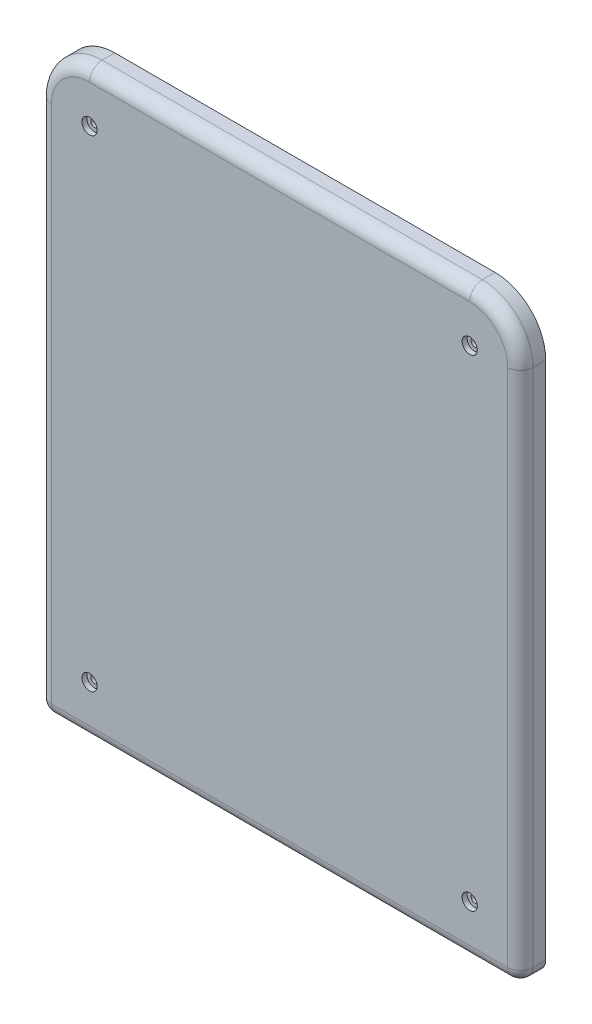
ISO-10303-21;
HEADER;
FILE_DESCRIPTION(('STEP AP214'),'2;1');
FILE_NAME('part.step','',(''),(''),'','','');
FILE_SCHEMA(('AUTOMOTIVE_DESIGN { 1 0 10303 214 1 1 1 1 }'));
ENDSEC;
DATA;
#1=APPLICATION_CONTEXT('core data for automotive mechanical design processes');
#2=APPLICATION_PROTOCOL_DEFINITION('international standard','automotive_design',2000,#1);
#3=PRODUCT_CONTEXT('',#1,'mechanical');
#4=PRODUCT('Part','Part','',(#3));
#5=PRODUCT_RELATED_PRODUCT_CATEGORY('part','',(#4));
#6=PRODUCT_DEFINITION_FORMATION('','',#4);
#7=PRODUCT_DEFINITION_CONTEXT('part definition',#1,'design');
#8=PRODUCT_DEFINITION('design','',#6,#7);
#9=PRODUCT_DEFINITION_SHAPE('','',#8);
#10=(LENGTH_UNIT() NAMED_UNIT(*) SI_UNIT(.MILLI.,.METRE.));
#11=(NAMED_UNIT(*) PLANE_ANGLE_UNIT() SI_UNIT($,.RADIAN.));
#12=(NAMED_UNIT(*) SI_UNIT($,.STERADIAN.) SOLID_ANGLE_UNIT());
#13=UNCERTAINTY_MEASURE_WITH_UNIT(LENGTH_MEASURE(1.E-05),#10,'distance_accuracy_value','');
#14=(GEOMETRIC_REPRESENTATION_CONTEXT(3) GLOBAL_UNCERTAINTY_ASSIGNED_CONTEXT((#13)) GLOBAL_UNIT_ASSIGNED_CONTEXT((#10,
#11,#12)) REPRESENTATION_CONTEXT('',''));
#15=CARTESIAN_POINT('',(0.,0.,0.));
#16=DIRECTION('',(0.,0.,1.));
#17=DIRECTION('',(1.,0.,0.));
#18=AXIS2_PLACEMENT_3D('',#15,#16,#17);
#19=CARTESIAN_POINT('',(20.,-174.28484726422,-0.000999999999999265));
#20=DIRECTION('',(0.,0.,1.));
#21=DIRECTION('',(1.,0.,0.));
#22=AXIS2_PLACEMENT_3D('',#19,#20,#21);
#23=CYLINDRICAL_SURFACE('',#22,1.5);
#24=CARTESIAN_POINT('',(20.,-174.28484726422,0.));
#25=DIRECTION('',(0.,0.,1.));
#26=DIRECTION('',(1.,0.,0.));
#27=AXIS2_PLACEMENT_3D('',#24,#25,#26);
#28=CIRCLE('',#27,1.5);
#29=CARTESIAN_POINT('',(21.5,-174.28484726422,0.));
#30=VERTEX_POINT('',#29);
#31=EDGE_CURVE('E145',#30,#30,#28,.F.);
#32=ORIENTED_EDGE('',*,*,#31,.T.);
#33=EDGE_LOOP('',(#32));
#34=FACE_BOUND('',#33,.T.);
#35=CARTESIAN_POINT('',(20.,-174.28484726422,8.));
#36=DIRECTION('',(0.,0.,1.));
#37=DIRECTION('',(1.,0.,0.));
#38=AXIS2_PLACEMENT_3D('',#35,#36,#37);
#39=CIRCLE('',#38,1.5);
#40=CARTESIAN_POINT('',(21.5,-174.28484726422,8.));
#41=VERTEX_POINT('',#40);
#42=EDGE_CURVE('E37',#41,#41,#39,.F.);
#43=ORIENTED_EDGE('',*,*,#42,.F.);
#44=EDGE_LOOP('',(#43));
#45=FACE_BOUND('',#44,.T.);
#46=ADVANCED_FACE('F33',(#34,#45),#23,.F.);
#47=CARTESIAN_POINT('',(170.,-174.28484726422,-0.000999999999999265));
#48=DIRECTION('',(0.,0.,1.));
#49=DIRECTION('',(1.,0.,0.));
#50=AXIS2_PLACEMENT_3D('',#47,#48,#49);
#51=CYLINDRICAL_SURFACE('',#50,1.5);
#52=CARTESIAN_POINT('',(170.,-174.28484726422,0.));
#53=DIRECTION('',(0.,0.,1.));
#54=DIRECTION('',(1.,0.,0.));
#55=AXIS2_PLACEMENT_3D('',#52,#53,#54);
#56=CIRCLE('',#55,1.5);
#57=CARTESIAN_POINT('',(171.5,-174.28484726422,0.));
#58=VERTEX_POINT('',#57);
#59=EDGE_CURVE('E237',#58,#58,#56,.F.);
#60=ORIENTED_EDGE('',*,*,#59,.T.);
#61=EDGE_LOOP('',(#60));
#62=FACE_BOUND('',#61,.T.);
#63=CARTESIAN_POINT('',(170.,-174.28484726422,8.));
#64=DIRECTION('',(0.,0.,1.));
#65=DIRECTION('',(1.,0.,0.));
#66=AXIS2_PLACEMENT_3D('',#63,#64,#65);
#67=CIRCLE('',#66,1.5);
#68=CARTESIAN_POINT('',(171.5,-174.28484726422,8.));
#69=VERTEX_POINT('',#68);
#70=EDGE_CURVE('E224',#69,#69,#67,.F.);
#71=ORIENTED_EDGE('',*,*,#70,.F.);
#72=EDGE_LOOP('',(#71));
#73=FACE_BOUND('',#72,.T.);
#74=ADVANCED_FACE('F340',(#62,#73),#51,.F.);
#75=CARTESIAN_POINT('',(170.,15.7151527357802,-0.000999999999999265));
#76=DIRECTION('',(0.,0.,1.));
#77=DIRECTION('',(1.,0.,0.));
#78=AXIS2_PLACEMENT_3D('',#75,#76,#77);
#79=CYLINDRICAL_SURFACE('',#78,1.5);
#80=CARTESIAN_POINT('',(170.,15.7151527357802,0.));
#81=DIRECTION('',(0.,0.,1.));
#82=DIRECTION('',(1.,0.,0.));
#83=AXIS2_PLACEMENT_3D('',#80,#81,#82);
#84=CIRCLE('',#83,1.5);
#85=CARTESIAN_POINT('',(171.5,15.7151527357802,0.));
#86=VERTEX_POINT('',#85);
#87=EDGE_CURVE('E233',#86,#86,#84,.F.);
#88=ORIENTED_EDGE('',*,*,#87,.T.);
#89=EDGE_LOOP('',(#88));
#90=FACE_BOUND('',#89,.T.);
#91=CARTESIAN_POINT('',(170.,15.7151527357802,8.));
#92=DIRECTION('',(0.,0.,1.));
#93=DIRECTION('',(1.,0.,0.));
#94=AXIS2_PLACEMENT_3D('',#91,#92,#93);
#95=CIRCLE('',#94,1.5);
#96=CARTESIAN_POINT('',(171.5,15.7151527357802,8.));
#97=VERTEX_POINT('',#96);
#98=EDGE_CURVE('E221',#97,#97,#95,.F.);
#99=ORIENTED_EDGE('',*,*,#98,.F.);
#100=EDGE_LOOP('',(#99));
#101=FACE_BOUND('',#100,.T.);
#102=ADVANCED_FACE('F346',(#90,#101),#79,.F.);
#103=CARTESIAN_POINT('',(20.,15.7151527357802,-0.000999999999999265));
#104=DIRECTION('',(0.,0.,1.));
#105=DIRECTION('',(1.,0.,0.));
#106=AXIS2_PLACEMENT_3D('',#103,#104,#105);
#107=CYLINDRICAL_SURFACE('',#106,1.5);
#108=CARTESIAN_POINT('',(20.,15.7151527357802,0.));
#109=DIRECTION('',(0.,0.,1.));
#110=DIRECTION('',(1.,0.,0.));
#111=AXIS2_PLACEMENT_3D('',#108,#109,#110);
#112=CIRCLE('',#111,1.5);
#113=CARTESIAN_POINT('',(21.5,15.7151527357802,0.));
#114=VERTEX_POINT('',#113);
#115=EDGE_CURVE('E229',#114,#114,#112,.F.);
#116=ORIENTED_EDGE('',*,*,#115,.T.);
#117=EDGE_LOOP('',(#116));
#118=FACE_BOUND('',#117,.T.);
#119=CARTESIAN_POINT('',(20.,15.7151527357802,8.));
#120=DIRECTION('',(0.,0.,1.));
#121=DIRECTION('',(1.,0.,0.));
#122=AXIS2_PLACEMENT_3D('',#119,#120,#121);
#123=CIRCLE('',#122,1.5);
#124=CARTESIAN_POINT('',(21.5,15.7151527357802,8.));
#125=VERTEX_POINT('',#124);
#126=EDGE_CURVE('E218',#125,#125,#123,.F.);
#127=ORIENTED_EDGE('',*,*,#126,.F.);
#128=EDGE_LOOP('',(#127));
#129=FACE_BOUND('',#128,.T.);
#130=ADVANCED_FACE('F352',(#118,#129),#107,.F.);
#131=CARTESIAN_POINT('',(20.,15.7151527357802,10.));
#132=DIRECTION('',(0.,0.,-1.));
#133=DIRECTION('',(-1.,0.,0.));
#134=AXIS2_PLACEMENT_3D('',#131,#132,#133);
#135=CYLINDRICAL_SURFACE('',#134,20.);
#136=DIRECTION('',(0.,0.,-1.));
#137=VECTOR('',#136,1.);
#138=CARTESIAN_POINT('',(0.,15.7151527357802,10.));
#139=LINE('',#138,#137);
#140=CARTESIAN_POINT('',(0.,15.7151527357802,5.));
#141=VERTEX_POINT('',#140);
#142=CARTESIAN_POINT('',(0.,15.7151527357802,0.));
#143=VERTEX_POINT('',#142);
#144=EDGE_CURVE('E115',#141,#143,#139,.T.);
#145=ORIENTED_EDGE('',*,*,#144,.F.);
#146=CARTESIAN_POINT('',(20.,15.7151527357802,5.));
#147=DIRECTION('',(0.,0.,1.));
#148=DIRECTION('',(1.,0.,0.));
#149=AXIS2_PLACEMENT_3D('',#146,#147,#148);
#150=CIRCLE('',#149,20.);
#151=CARTESIAN_POINT('',(20.,35.7151527357802,5.));
#152=VERTEX_POINT('',#151);
#153=EDGE_CURVE('E11',#141,#152,#150,.F.);
#154=ORIENTED_EDGE('',*,*,#153,.T.);
#155=DIRECTION('',(0.,0.,-1.));
#156=VECTOR('',#155,1.);
#157=CARTESIAN_POINT('',(20.,35.7151527357802,10.));
#158=LINE('',#157,#156);
#159=CARTESIAN_POINT('',(20.,35.7151527357802,0.));
#160=VERTEX_POINT('',#159);
#161=EDGE_CURVE('E137',#152,#160,#158,.T.);
#162=ORIENTED_EDGE('',*,*,#161,.T.);
#163=CARTESIAN_POINT('',(20.,15.7151527357802,0.));
#164=DIRECTION('',(0.,0.,1.));
#165=DIRECTION('',(1.,0.,0.));
#166=AXIS2_PLACEMENT_3D('',#163,#164,#165);
#167=CIRCLE('',#166,20.);
#168=EDGE_CURVE('E130',#160,#143,#167,.T.);
#169=ORIENTED_EDGE('',*,*,#168,.T.);
#170=EDGE_LOOP('',(#145,#154,#162,#169));
#171=FACE_BOUND('',#170,.T.);
#172=ADVANCED_FACE('F135',(#171),#135,.T.);
#173=CARTESIAN_POINT('',(0.,15.7151527357802,10.));
#174=DIRECTION('',(1.,0.,0.));
#175=DIRECTION('',(0.,0.,-1.));
#176=AXIS2_PLACEMENT_3D('',#173,#174,#175);
#177=PLANE('',#176);
#178=DIRECTION('',(0.,0.,-1.));
#179=VECTOR('',#178,1.);
#180=CARTESIAN_POINT('',(0.,-189.28484726422,10.));
#181=LINE('',#180,#179);
#182=CARTESIAN_POINT('',(0.,-189.28484726422,5.));
#183=VERTEX_POINT('',#182);
#184=CARTESIAN_POINT('',(0.,-189.28484726422,0.));
#185=VERTEX_POINT('',#184);
#186=EDGE_CURVE('E124',#183,#185,#181,.T.);
#187=ORIENTED_EDGE('',*,*,#186,.F.);
#188=DIRECTION('',(0.,-1.,0.));
#189=VECTOR('',#188,1.);
#190=CARTESIAN_POINT('',(0.,15.7151527357802,5.));
#191=LINE('',#190,#189);
#192=EDGE_CURVE('E42',#183,#141,#191,.F.);
#193=ORIENTED_EDGE('',*,*,#192,.T.);
#194=ORIENTED_EDGE('',*,*,#144,.T.);
#195=DIRECTION('',(0.,-1.,0.));
#196=VECTOR('',#195,1.);
#197=CARTESIAN_POINT('',(0.,15.7151527357802,0.));
#198=LINE('',#197,#196);
#199=EDGE_CURVE('E118',#143,#185,#198,.T.);
#200=ORIENTED_EDGE('',*,*,#199,.T.);
#201=EDGE_LOOP('',(#187,#193,#194,#200));
#202=FACE_BOUND('',#201,.T.);
#203=ADVANCED_FACE('F117',(#202),#177,.F.);
#204=CARTESIAN_POINT('',(5.,-189.28484726422,10.));
#205=DIRECTION('',(0.,0.,-1.));
#206=DIRECTION('',(-1.,0.,0.));
#207=AXIS2_PLACEMENT_3D('',#204,#205,#206);
#208=CYLINDRICAL_SURFACE('',#207,5.);
#209=DIRECTION('',(0.,0.,-1.));
#210=VECTOR('',#209,1.);
#211=CARTESIAN_POINT('',(5.,-194.28484726422,10.));
#212=LINE('',#211,#210);
#213=CARTESIAN_POINT('',(5.,-194.28484726422,5.));
#214=VERTEX_POINT('',#213);
#215=CARTESIAN_POINT('',(5.,-194.28484726422,0.));
#216=VERTEX_POINT('',#215);
#217=EDGE_CURVE('E172',#214,#216,#212,.T.);
#218=ORIENTED_EDGE('',*,*,#217,.F.);
#219=CARTESIAN_POINT('',(5.,-189.28484726422,5.));
#220=DIRECTION('',(0.,0.,-1.));
#221=DIRECTION('',(-1.,0.,0.));
#222=AXIS2_PLACEMENT_3D('',#219,#220,#221);
#223=CIRCLE('',#222,5.);
#224=EDGE_CURVE('E57',#214,#183,#223,.T.);
#225=ORIENTED_EDGE('',*,*,#224,.T.);
#226=ORIENTED_EDGE('',*,*,#186,.T.);
#227=CARTESIAN_POINT('',(5.,-189.28484726422,0.));
#228=DIRECTION('',(0.,0.,1.));
#229=DIRECTION('',(1.,0.,0.));
#230=AXIS2_PLACEMENT_3D('',#227,#228,#229);
#231=CIRCLE('',#230,5.);
#232=EDGE_CURVE('E133',#185,#216,#231,.T.);
#233=ORIENTED_EDGE('',*,*,#232,.T.);
#234=EDGE_LOOP('',(#218,#225,#226,#233));
#235=FACE_BOUND('',#234,.T.);
#236=ADVANCED_FACE('F413',(#235),#208,.T.);
#237=CARTESIAN_POINT('',(5.,-194.28484726422,10.));
#238=DIRECTION('',(0.,1.,0.));
#239=DIRECTION('',(0.,0.,1.));
#240=AXIS2_PLACEMENT_3D('',#237,#238,#239);
#241=PLANE('',#240);
#242=DIRECTION('',(0.,0.,-1.));
#243=VECTOR('',#242,1.);
#244=CARTESIAN_POINT('',(185.,-194.28484726422,10.));
#245=LINE('',#244,#243);
#246=CARTESIAN_POINT('',(185.,-194.28484726422,5.));
#247=VERTEX_POINT('',#246);
#248=CARTESIAN_POINT('',(185.,-194.28484726422,0.));
#249=VERTEX_POINT('',#248);
#250=EDGE_CURVE('E170',#247,#249,#245,.T.);
#251=ORIENTED_EDGE('',*,*,#250,.F.);
#252=DIRECTION('',(1.,0.,0.));
#253=VECTOR('',#252,1.);
#254=CARTESIAN_POINT('',(5.,-194.28484726422,5.));
#255=LINE('',#254,#253);
#256=EDGE_CURVE('E196',#247,#214,#255,.F.);
#257=ORIENTED_EDGE('',*,*,#256,.T.);
#258=ORIENTED_EDGE('',*,*,#217,.T.);
#259=DIRECTION('',(1.,0.,0.));
#260=VECTOR('',#259,1.);
#261=CARTESIAN_POINT('',(5.,-194.28484726422,0.));
#262=LINE('',#261,#260);
#263=EDGE_CURVE('E149',#216,#249,#262,.T.);
#264=ORIENTED_EDGE('',*,*,#263,.T.);
#265=EDGE_LOOP('',(#251,#257,#258,#264));
#266=FACE_BOUND('',#265,.T.);
#267=ADVANCED_FACE('F556',(#266),#241,.F.);
#268=CARTESIAN_POINT('',(185.,-189.28484726422,10.));
#269=DIRECTION('',(0.,0.,-1.));
#270=DIRECTION('',(-1.,0.,0.));
#271=AXIS2_PLACEMENT_3D('',#268,#269,#270);
#272=CYLINDRICAL_SURFACE('',#271,4.99999999999998);
#273=DIRECTION('',(0.,0.,-1.));
#274=VECTOR('',#273,1.);
#275=CARTESIAN_POINT('',(190.,-189.28484726422,10.));
#276=LINE('',#275,#274);
#277=CARTESIAN_POINT('',(190.,-189.28484726422,5.));
#278=VERTEX_POINT('',#277);
#279=CARTESIAN_POINT('',(190.,-189.28484726422,0.));
#280=VERTEX_POINT('',#279);
#281=EDGE_CURVE('E168',#278,#280,#276,.T.);
#282=ORIENTED_EDGE('',*,*,#281,.F.);
#283=CARTESIAN_POINT('',(185.,-189.28484726422,5.));
#284=DIRECTION('',(0.,0.,-1.));
#285=DIRECTION('',(-1.,0.,0.));
#286=AXIS2_PLACEMENT_3D('',#283,#284,#285);
#287=CIRCLE('',#286,4.99999999999998);
#288=EDGE_CURVE('E194',#278,#247,#287,.T.);
#289=ORIENTED_EDGE('',*,*,#288,.T.);
#290=ORIENTED_EDGE('',*,*,#250,.T.);
#291=CARTESIAN_POINT('',(185.,-189.28484726422,0.));
#292=DIRECTION('',(0.,0.,1.));
#293=DIRECTION('',(-1.,0.,0.));
#294=AXIS2_PLACEMENT_3D('',#291,#292,#293);
#295=CIRCLE('',#294,4.99999999999998);
#296=EDGE_CURVE('E152',#249,#280,#295,.T.);
#297=ORIENTED_EDGE('',*,*,#296,.T.);
#298=EDGE_LOOP('',(#282,#289,#290,#297));
#299=FACE_BOUND('',#298,.T.);
#300=ADVANCED_FACE('F323',(#299),#272,.T.);
#301=CARTESIAN_POINT('',(190.,15.7151527357802,10.));
#302=DIRECTION('',(-1.,0.,0.));
#303=DIRECTION('',(0.,0.,1.));
#304=AXIS2_PLACEMENT_3D('',#301,#302,#303);
#305=PLANE('',#304);
#306=DIRECTION('',(0.,0.,-1.));
#307=VECTOR('',#306,1.);
#308=CARTESIAN_POINT('',(190.,15.7151527357802,10.));
#309=LINE('',#308,#307);
#310=CARTESIAN_POINT('',(190.,15.7151527357802,5.));
#311=VERTEX_POINT('',#310);
#312=CARTESIAN_POINT('',(190.,15.7151527357802,0.));
#313=VERTEX_POINT('',#312);
#314=EDGE_CURVE('E166',#311,#313,#309,.T.);
#315=ORIENTED_EDGE('',*,*,#314,.F.);
#316=DIRECTION('',(0.,1.,0.));
#317=VECTOR('',#316,1.);
#318=CARTESIAN_POINT('',(190.,-189.28484726422,5.));
#319=LINE('',#318,#317);
#320=EDGE_CURVE('E192',#311,#278,#319,.F.);
#321=ORIENTED_EDGE('',*,*,#320,.T.);
#322=ORIENTED_EDGE('',*,*,#281,.T.);
#323=DIRECTION('',(0.,1.,0.));
#324=VECTOR('',#323,1.);
#325=CARTESIAN_POINT('',(190.,15.7151527357802,0.));
#326=LINE('',#325,#324);
#327=EDGE_CURVE('E155',#280,#313,#326,.T.);
#328=ORIENTED_EDGE('',*,*,#327,.T.);
#329=EDGE_LOOP('',(#315,#321,#322,#328));
#330=FACE_BOUND('',#329,.T.);
#331=ADVANCED_FACE('F321',(#330),#305,.F.);
#332=CARTESIAN_POINT('',(170.,15.7151527357802,10.));
#333=DIRECTION('',(0.,0.,-1.));
#334=DIRECTION('',(-1.,0.,0.));
#335=AXIS2_PLACEMENT_3D('',#332,#333,#334);
#336=CYLINDRICAL_SURFACE('',#335,20.);
#337=DIRECTION('',(0.,0.,-1.));
#338=VECTOR('',#337,1.);
#339=CARTESIAN_POINT('',(170.,35.7151527357802,10.));
#340=LINE('',#339,#338);
#341=CARTESIAN_POINT('',(170.,35.7151527357802,5.));
#342=VERTEX_POINT('',#341);
#343=CARTESIAN_POINT('',(170.,35.7151527357802,0.));
#344=VERTEX_POINT('',#343);
#345=EDGE_CURVE('E164',#342,#344,#340,.T.);
#346=ORIENTED_EDGE('',*,*,#345,.F.);
#347=CARTESIAN_POINT('',(170.,15.7151527357802,5.));
#348=DIRECTION('',(0.,0.,1.));
#349=DIRECTION('',(1.,0.,0.));
#350=AXIS2_PLACEMENT_3D('',#347,#348,#349);
#351=CIRCLE('',#350,20.);
#352=EDGE_CURVE('E190',#342,#311,#351,.F.);
#353=ORIENTED_EDGE('',*,*,#352,.T.);
#354=ORIENTED_EDGE('',*,*,#314,.T.);
#355=CARTESIAN_POINT('',(170.,15.7151527357802,0.));
#356=DIRECTION('',(0.,0.,1.));
#357=DIRECTION('',(-1.,0.,0.));
#358=AXIS2_PLACEMENT_3D('',#355,#356,#357);
#359=CIRCLE('',#358,20.);
#360=EDGE_CURVE('E158',#313,#344,#359,.T.);
#361=ORIENTED_EDGE('',*,*,#360,.T.);
#362=EDGE_LOOP('',(#346,#353,#354,#361));
#363=FACE_BOUND('',#362,.T.);
#364=ADVANCED_FACE('F330',(#363),#336,.T.);
#365=CARTESIAN_POINT('',(20.,35.7151527357802,10.));
#366=DIRECTION('',(0.,-1.,0.));
#367=DIRECTION('',(0.,0.,-1.));
#368=AXIS2_PLACEMENT_3D('',#365,#366,#367);
#369=PLANE('',#368);
#370=ORIENTED_EDGE('',*,*,#161,.F.);
#371=DIRECTION('',(-1.,0.,0.));
#372=VECTOR('',#371,1.);
#373=CARTESIAN_POINT('',(170.,35.7151527357802,5.));
#374=LINE('',#373,#372);
#375=EDGE_CURVE('E187',#152,#342,#374,.F.);
#376=ORIENTED_EDGE('',*,*,#375,.T.);
#377=ORIENTED_EDGE('',*,*,#345,.T.);
#378=DIRECTION('',(-1.,0.,0.));
#379=VECTOR('',#378,1.);
#380=CARTESIAN_POINT('',(20.,35.7151527357802,0.));
#381=LINE('',#380,#379);
#382=EDGE_CURVE('E161',#344,#160,#381,.T.);
#383=ORIENTED_EDGE('',*,*,#382,.T.);
#384=EDGE_LOOP('',(#370,#376,#377,#383));
#385=FACE_BOUND('',#384,.T.);
#386=ADVANCED_FACE('F279',(#385),#369,.F.);
#387=CARTESIAN_POINT('',(20.,15.7151527357802,10.));
#388=DIRECTION('',(0.,0.,1.));
#389=DIRECTION('',(1.,0.,0.));
#390=AXIS2_PLACEMENT_3D('',#387,#388,#389);
#391=PLANE('',#390);
#392=CARTESIAN_POINT('',(20.,-174.28484726422,10.));
#393=DIRECTION('',(0.,0.,1.));
#394=DIRECTION('',(1.,0.,0.));
#395=AXIS2_PLACEMENT_3D('',#392,#393,#394);
#396=CIRCLE('',#395,3.);
#397=CARTESIAN_POINT('',(23.,-174.28484726422,10.));
#398=VERTEX_POINT('',#397);
#399=EDGE_CURVE('E248',#398,#398,#396,.T.);
#400=ORIENTED_EDGE('',*,*,#399,.F.);
#401=EDGE_LOOP('',(#400));
#402=FACE_BOUND('',#401,.T.);
#403=CARTESIAN_POINT('',(170.,-174.28484726422,10.));
#404=DIRECTION('',(0.,0.,1.));
#405=DIRECTION('',(1.,0.,0.));
#406=AXIS2_PLACEMENT_3D('',#403,#404,#405);
#407=CIRCLE('',#406,2.99999999999999);
#408=CARTESIAN_POINT('',(173.,-174.28484726422,10.));
#409=VERTEX_POINT('',#408);
#410=EDGE_CURVE('E254',#409,#409,#407,.T.);
#411=ORIENTED_EDGE('',*,*,#410,.F.);
#412=EDGE_LOOP('',(#411));
#413=FACE_BOUND('',#412,.T.);
#414=CARTESIAN_POINT('',(170.,15.7151527357802,10.));
#415=DIRECTION('',(0.,0.,1.));
#416=DIRECTION('',(1.,0.,0.));
#417=AXIS2_PLACEMENT_3D('',#414,#415,#416);
#418=CIRCLE('',#417,2.99999999999999);
#419=CARTESIAN_POINT('',(173.,15.7151527357802,10.));
#420=VERTEX_POINT('',#419);
#421=EDGE_CURVE('E260',#420,#420,#418,.T.);
#422=ORIENTED_EDGE('',*,*,#421,.F.);
#423=EDGE_LOOP('',(#422));
#424=FACE_BOUND('',#423,.T.);
#425=CARTESIAN_POINT('',(20.,15.7151527357802,10.));
#426=DIRECTION('',(0.,0.,1.));
#427=DIRECTION('',(1.,0.,0.));
#428=AXIS2_PLACEMENT_3D('',#425,#426,#427);
#429=CIRCLE('',#428,3.);
#430=CARTESIAN_POINT('',(23.,15.7151527357802,10.));
#431=VERTEX_POINT('',#430);
#432=EDGE_CURVE('E242',#431,#431,#429,.T.);
#433=ORIENTED_EDGE('',*,*,#432,.F.);
#434=EDGE_LOOP('',(#433));
#435=FACE_BOUND('',#434,.T.);
#436=CARTESIAN_POINT('',(170.,15.7151527357802,10.));
#437=DIRECTION('',(0.,0.,1.));
#438=DIRECTION('',(1.,0.,0.));
#439=AXIS2_PLACEMENT_3D('',#436,#437,#438);
#440=CIRCLE('',#439,15.);
#441=CARTESIAN_POINT('',(185.,15.7151527357802,10.));
#442=VERTEX_POINT('',#441);
#443=CARTESIAN_POINT('',(170.,30.7151527357802,10.));
#444=VERTEX_POINT('',#443);
#445=EDGE_CURVE('E182',#442,#444,#440,.T.);
#446=ORIENTED_EDGE('',*,*,#445,.T.);
#447=DIRECTION('',(-1.,0.,0.));
#448=VECTOR('',#447,1.);
#449=CARTESIAN_POINT('',(20.,30.7151527357802,10.));
#450=LINE('',#449,#448);
#451=CARTESIAN_POINT('',(20.,30.7151527357802,10.));
#452=VERTEX_POINT('',#451);
#453=EDGE_CURVE('E184',#444,#452,#450,.T.);
#454=ORIENTED_EDGE('',*,*,#453,.T.);
#455=CARTESIAN_POINT('',(20.,15.7151527357802,10.));
#456=DIRECTION('',(0.,0.,1.));
#457=DIRECTION('',(1.,0.,0.));
#458=AXIS2_PLACEMENT_3D('',#455,#456,#457);
#459=CIRCLE('',#458,15.);
#460=CARTESIAN_POINT('',(5.,15.7151527357802,10.));
#461=VERTEX_POINT('',#460);
#462=EDGE_CURVE('E123',#452,#461,#459,.T.);
#463=ORIENTED_EDGE('',*,*,#462,.T.);
#464=DIRECTION('',(0.,-1.,0.));
#465=VECTOR('',#464,1.);
#466=CARTESIAN_POINT('',(5.,-189.28484726422,10.));
#467=LINE('',#466,#465);
#468=CARTESIAN_POINT('',(5.,-189.28484726422,10.));
#469=VERTEX_POINT('',#468);
#470=EDGE_CURVE('E176',#461,#469,#467,.T.);
#471=ORIENTED_EDGE('',*,*,#470,.T.);
#472=DIRECTION('',(1.,0.,0.));
#473=VECTOR('',#472,1.);
#474=CARTESIAN_POINT('',(185.,-189.28484726422,10.));
#475=LINE('',#474,#473);
#476=CARTESIAN_POINT('',(185.,-189.28484726422,10.));
#477=VERTEX_POINT('',#476);
#478=EDGE_CURVE('E178',#469,#477,#475,.T.);
#479=ORIENTED_EDGE('',*,*,#478,.T.);
#480=DIRECTION('',(0.,1.,0.));
#481=VECTOR('',#480,1.);
#482=CARTESIAN_POINT('',(185.,15.7151527357802,10.));
#483=LINE('',#482,#481);
#484=EDGE_CURVE('E180',#477,#442,#483,.T.);
#485=ORIENTED_EDGE('',*,*,#484,.T.);
#486=EDGE_LOOP('',(#446,#454,#463,#471,#479,#485));
#487=FACE_BOUND('',#486,.T.);
#488=ADVANCED_FACE('F276',(#402,#413,#424,#435,#487),#391,.T.);
#489=CARTESIAN_POINT('',(20.,15.7151527357802,0.));
#490=DIRECTION('',(0.,0.,1.));
#491=DIRECTION('',(1.,0.,0.));
#492=AXIS2_PLACEMENT_3D('',#489,#490,#491);
#493=PLANE('',#492);
#494=ORIENTED_EDGE('',*,*,#115,.F.);
#495=EDGE_LOOP('',(#494));
#496=FACE_BOUND('',#495,.T.);
#497=ORIENTED_EDGE('',*,*,#87,.F.);
#498=EDGE_LOOP('',(#497));
#499=FACE_BOUND('',#498,.T.);
#500=ORIENTED_EDGE('',*,*,#59,.F.);
#501=EDGE_LOOP('',(#500));
#502=FACE_BOUND('',#501,.T.);
#503=ORIENTED_EDGE('',*,*,#31,.F.);
#504=EDGE_LOOP('',(#503));
#505=FACE_BOUND('',#504,.T.);
#506=ORIENTED_EDGE('',*,*,#168,.F.);
#507=ORIENTED_EDGE('',*,*,#382,.F.);
#508=ORIENTED_EDGE('',*,*,#360,.F.);
#509=ORIENTED_EDGE('',*,*,#327,.F.);
#510=ORIENTED_EDGE('',*,*,#296,.F.);
#511=ORIENTED_EDGE('',*,*,#263,.F.);
#512=ORIENTED_EDGE('',*,*,#232,.F.);
#513=ORIENTED_EDGE('',*,*,#199,.F.);
#514=EDGE_LOOP('',(#506,#507,#508,#509,#510,#511,#512,#513));
#515=FACE_BOUND('',#514,.T.);
#516=ADVANCED_FACE('F128',(#496,#499,#502,#505,#515),#493,.F.);
#517=CARTESIAN_POINT('',(20.,-189.28484726422,5.));
#518=DIRECTION('',(-1.,0.,0.));
#519=DIRECTION('',(0.,0.,1.));
#520=AXIS2_PLACEMENT_3D('',#517,#518,#519);
#521=CYLINDRICAL_SURFACE('',#520,5.);
#522=CARTESIAN_POINT('',(5.,-189.28484726422,5.));
#523=DIRECTION('',(-1.,0.,0.));
#524=DIRECTION('',(0.,0.,1.));
#525=AXIS2_PLACEMENT_3D('',#522,#523,#524);
#526=CIRCLE('',#525,5.);
#527=EDGE_CURVE('E142',#214,#469,#526,.T.);
#528=ORIENTED_EDGE('',*,*,#527,.F.);
#529=ORIENTED_EDGE('',*,*,#256,.F.);
#530=CARTESIAN_POINT('',(185.,-189.28484726422,5.));
#531=DIRECTION('',(1.,0.,0.));
#532=DIRECTION('',(0.,1.,0.));
#533=AXIS2_PLACEMENT_3D('',#530,#531,#532);
#534=CIRCLE('',#533,5.);
#535=EDGE_CURVE('E139',#477,#247,#534,.T.);
#536=ORIENTED_EDGE('',*,*,#535,.F.);
#537=ORIENTED_EDGE('',*,*,#478,.F.);
#538=EDGE_LOOP('',(#528,#529,#536,#537));
#539=FACE_BOUND('',#538,.T.);
#540=ADVANCED_FACE('F35',(#539),#521,.T.);
#541=CARTESIAN_POINT('',(185.,-189.28484726422,5.));
#542=DIRECTION('',(0.,0.,1.));
#543=DIRECTION('',(1.,0.,0.));
#544=AXIS2_PLACEMENT_3D('',#541,#542,#543);
#545=SPHERICAL_SURFACE('',#544,5.);
#546=ORIENTED_EDGE('',*,*,#535,.T.);
#547=ORIENTED_EDGE('',*,*,#288,.F.);
#548=CARTESIAN_POINT('',(185.,-189.28484726422,5.));
#549=DIRECTION('',(0.,1.,0.));
#550=DIRECTION('',(-1.,0.,0.));
#551=AXIS2_PLACEMENT_3D('',#548,#549,#550);
#552=CIRCLE('',#551,5.);
#553=EDGE_CURVE('E213',#477,#278,#552,.T.);
#554=ORIENTED_EDGE('',*,*,#553,.F.);
#555=EDGE_LOOP('',(#546,#547,#554));
#556=FACE_BOUND('',#555,.T.);
#557=ADVANCED_FACE('F314',(#556),#545,.T.);
#558=CARTESIAN_POINT('',(5.,-189.28484726422,5.));
#559=DIRECTION('',(0.,0.,1.));
#560=DIRECTION('',(1.,0.,0.));
#561=AXIS2_PLACEMENT_3D('',#558,#559,#560);
#562=SPHERICAL_SURFACE('',#561,5.);
#563=ORIENTED_EDGE('',*,*,#224,.F.);
#564=ORIENTED_EDGE('',*,*,#527,.T.);
#565=CARTESIAN_POINT('',(5.,-189.28484726422,5.));
#566=DIRECTION('',(0.,1.,0.));
#567=DIRECTION('',(-1.,0.,0.));
#568=AXIS2_PLACEMENT_3D('',#565,#566,#567);
#569=CIRCLE('',#568,5.);
#570=EDGE_CURVE('E210',#183,#469,#569,.T.);
#571=ORIENTED_EDGE('',*,*,#570,.F.);
#572=EDGE_LOOP('',(#563,#564,#571));
#573=FACE_BOUND('',#572,.T.);
#574=ADVANCED_FACE('F306',(#573),#562,.T.);
#575=CARTESIAN_POINT('',(185.,15.7151527357802,5.));
#576=DIRECTION('',(0.,-1.,0.));
#577=DIRECTION('',(0.,0.,-1.));
#578=AXIS2_PLACEMENT_3D('',#575,#576,#577);
#579=CYLINDRICAL_SURFACE('',#578,5.);
#580=ORIENTED_EDGE('',*,*,#553,.T.);
#581=ORIENTED_EDGE('',*,*,#320,.F.);
#582=CARTESIAN_POINT('',(185.,15.7151527357802,5.));
#583=DIRECTION('',(0.,1.,0.));
#584=DIRECTION('',(0.,0.,1.));
#585=AXIS2_PLACEMENT_3D('',#582,#583,#584);
#586=CIRCLE('',#585,5.);
#587=EDGE_CURVE('E207',#442,#311,#586,.T.);
#588=ORIENTED_EDGE('',*,*,#587,.F.);
#589=ORIENTED_EDGE('',*,*,#484,.F.);
#590=EDGE_LOOP('',(#580,#581,#588,#589));
#591=FACE_BOUND('',#590,.T.);
#592=ADVANCED_FACE('F317',(#591),#579,.T.);
#593=CARTESIAN_POINT('',(5.,15.7151527357802,5.));
#594=DIRECTION('',(0.,1.,0.));
#595=DIRECTION('',(0.,0.,1.));
#596=AXIS2_PLACEMENT_3D('',#593,#594,#595);
#597=CYLINDRICAL_SURFACE('',#596,5.);
#598=ORIENTED_EDGE('',*,*,#570,.T.);
#599=ORIENTED_EDGE('',*,*,#470,.F.);
#600=CARTESIAN_POINT('',(5.,15.7151527357802,5.));
#601=DIRECTION('',(0.,1.,0.));
#602=DIRECTION('',(0.,0.,1.));
#603=AXIS2_PLACEMENT_3D('',#600,#601,#602);
#604=CIRCLE('',#603,5.);
#605=EDGE_CURVE('E204',#141,#461,#604,.T.);
#606=ORIENTED_EDGE('',*,*,#605,.F.);
#607=ORIENTED_EDGE('',*,*,#192,.F.);
#608=EDGE_LOOP('',(#598,#599,#606,#607));
#609=FACE_BOUND('',#608,.T.);
#610=ADVANCED_FACE('F303',(#609),#597,.T.);
#611=CARTESIAN_POINT('',(170.,15.7151527357802,5.));
#612=DIRECTION('',(0.,0.,1.));
#613=DIRECTION('',(1.,0.,0.));
#614=AXIS2_PLACEMENT_3D('',#611,#612,#613);
#615=TOROIDAL_SURFACE('',#614,15.,5.);
#616=ORIENTED_EDGE('',*,*,#587,.T.);
#617=ORIENTED_EDGE('',*,*,#352,.F.);
#618=CARTESIAN_POINT('',(170.,30.7151527357802,5.));
#619=DIRECTION('',(-1.,0.,0.));
#620=DIRECTION('',(0.,0.,1.));
#621=AXIS2_PLACEMENT_3D('',#618,#619,#620);
#622=CIRCLE('',#621,5.);
#623=EDGE_CURVE('E202',#444,#342,#622,.T.);
#624=ORIENTED_EDGE('',*,*,#623,.F.);
#625=ORIENTED_EDGE('',*,*,#445,.F.);
#626=EDGE_LOOP('',(#616,#617,#624,#625));
#627=FACE_BOUND('',#626,.T.);
#628=ADVANCED_FACE('F291',(#627),#615,.T.);
#629=CARTESIAN_POINT('',(20.,15.7151527357802,5.));
#630=DIRECTION('',(0.,0.,1.));
#631=DIRECTION('',(1.,0.,0.));
#632=AXIS2_PLACEMENT_3D('',#629,#630,#631);
#633=TOROIDAL_SURFACE('',#632,15.,5.);
#634=ORIENTED_EDGE('',*,*,#605,.T.);
#635=ORIENTED_EDGE('',*,*,#462,.F.);
#636=CARTESIAN_POINT('',(20.,30.7151527357802,5.));
#637=DIRECTION('',(1.,0.,0.));
#638=DIRECTION('',(0.,0.,-1.));
#639=AXIS2_PLACEMENT_3D('',#636,#637,#638);
#640=CIRCLE('',#639,5.);
#641=EDGE_CURVE('E200',#152,#452,#640,.T.);
#642=ORIENTED_EDGE('',*,*,#641,.F.);
#643=ORIENTED_EDGE('',*,*,#153,.F.);
#644=EDGE_LOOP('',(#634,#635,#642,#643));
#645=FACE_BOUND('',#644,.T.);
#646=ADVANCED_FACE('F299',(#645),#633,.T.);
#647=CARTESIAN_POINT('',(20.,30.7151527357802,5.));
#648=DIRECTION('',(1.,0.,0.));
#649=DIRECTION('',(0.,0.,-1.));
#650=AXIS2_PLACEMENT_3D('',#647,#648,#649);
#651=CYLINDRICAL_SURFACE('',#650,5.);
#652=ORIENTED_EDGE('',*,*,#623,.T.);
#653=ORIENTED_EDGE('',*,*,#375,.F.);
#654=ORIENTED_EDGE('',*,*,#641,.T.);
#655=ORIENTED_EDGE('',*,*,#453,.F.);
#656=EDGE_LOOP('',(#652,#653,#654,#655));
#657=FACE_BOUND('',#656,.T.);
#658=ADVANCED_FACE('F294',(#657),#651,.T.);
#659=CARTESIAN_POINT('',(20.,15.7151527357802,8.));
#660=DIRECTION('',(0.,0.,1.));
#661=DIRECTION('',(1.,0.,0.));
#662=AXIS2_PLACEMENT_3D('',#659,#660,#661);
#663=PLANE('',#662);
#664=CARTESIAN_POINT('',(20.,15.7151527357802,8.));
#665=DIRECTION('',(0.,0.,1.));
#666=DIRECTION('',(1.,0.,0.));
#667=AXIS2_PLACEMENT_3D('',#664,#665,#666);
#668=CIRCLE('',#667,3.);
#669=CARTESIAN_POINT('',(23.,15.7151527357802,8.));
#670=VERTEX_POINT('',#669);
#671=EDGE_CURVE('E222',#670,#670,#668,.T.);
#672=ORIENTED_EDGE('',*,*,#671,.T.);
#673=EDGE_LOOP('',(#672));
#674=FACE_BOUND('',#673,.T.);
#675=ORIENTED_EDGE('',*,*,#126,.T.);
#676=EDGE_LOOP('',(#675));
#677=FACE_BOUND('',#676,.T.);
#678=ADVANCED_FACE('F376',(#674,#677),#663,.T.);
#679=CARTESIAN_POINT('',(20.,15.7151527357802,8.));
#680=DIRECTION('',(0.,0.,1.));
#681=DIRECTION('',(1.,0.,0.));
#682=AXIS2_PLACEMENT_3D('',#679,#680,#681);
#683=CYLINDRICAL_SURFACE('',#682,3.);
#684=ORIENTED_EDGE('',*,*,#671,.F.);
#685=EDGE_LOOP('',(#684));
#686=FACE_BOUND('',#685,.T.);
#687=ORIENTED_EDGE('',*,*,#432,.T.);
#688=EDGE_LOOP('',(#687));
#689=FACE_BOUND('',#688,.T.);
#690=ADVANCED_FACE('F371',(#686,#689),#683,.F.);
#691=CARTESIAN_POINT('',(170.,15.7151527357802,8.));
#692=DIRECTION('',(0.,0.,1.));
#693=DIRECTION('',(1.,0.,0.));
#694=AXIS2_PLACEMENT_3D('',#691,#692,#693);
#695=PLANE('',#694);
#696=CARTESIAN_POINT('',(170.,15.7151527357802,8.));
#697=DIRECTION('',(0.,0.,1.));
#698=DIRECTION('',(1.,0.,0.));
#699=AXIS2_PLACEMENT_3D('',#696,#697,#698);
#700=CIRCLE('',#699,2.99999999999999);
#701=CARTESIAN_POINT('',(173.,15.7151527357802,8.));
#702=VERTEX_POINT('',#701);
#703=EDGE_CURVE('E245',#702,#702,#700,.T.);
#704=ORIENTED_EDGE('',*,*,#703,.T.);
#705=EDGE_LOOP('',(#704));
#706=FACE_BOUND('',#705,.T.);
#707=ORIENTED_EDGE('',*,*,#98,.T.);
#708=EDGE_LOOP('',(#707));
#709=FACE_BOUND('',#708,.T.);
#710=ADVANCED_FACE('F266',(#706,#709),#695,.T.);
#711=CARTESIAN_POINT('',(170.,15.7151527357802,8.));
#712=DIRECTION('',(0.,0.,1.));
#713=DIRECTION('',(1.,0.,0.));
#714=AXIS2_PLACEMENT_3D('',#711,#712,#713);
#715=CYLINDRICAL_SURFACE('',#714,2.99999999999999);
#716=ORIENTED_EDGE('',*,*,#703,.F.);
#717=EDGE_LOOP('',(#716));
#718=FACE_BOUND('',#717,.T.);
#719=ORIENTED_EDGE('',*,*,#421,.T.);
#720=EDGE_LOOP('',(#719));
#721=FACE_BOUND('',#720,.T.);
#722=ADVANCED_FACE('F269',(#718,#721),#715,.F.);
#723=CARTESIAN_POINT('',(170.,-174.28484726422,8.));
#724=DIRECTION('',(0.,0.,1.));
#725=DIRECTION('',(1.,0.,0.));
#726=AXIS2_PLACEMENT_3D('',#723,#724,#725);
#727=PLANE('',#726);
#728=CARTESIAN_POINT('',(170.,-174.28484726422,8.));
#729=DIRECTION('',(0.,0.,1.));
#730=DIRECTION('',(1.,0.,0.));
#731=AXIS2_PLACEMENT_3D('',#728,#729,#730);
#732=CIRCLE('',#731,2.99999999999999);
#733=CARTESIAN_POINT('',(173.,-174.28484726422,8.));
#734=VERTEX_POINT('',#733);
#735=EDGE_CURVE('E257',#734,#734,#732,.T.);
#736=ORIENTED_EDGE('',*,*,#735,.T.);
#737=EDGE_LOOP('',(#736));
#738=FACE_BOUND('',#737,.T.);
#739=ORIENTED_EDGE('',*,*,#70,.T.);
#740=EDGE_LOOP('',(#739));
#741=FACE_BOUND('',#740,.T.);
#742=ADVANCED_FACE('F272',(#738,#741),#727,.T.);
#743=CARTESIAN_POINT('',(170.,-174.28484726422,8.));
#744=DIRECTION('',(0.,0.,1.));
#745=DIRECTION('',(1.,0.,0.));
#746=AXIS2_PLACEMENT_3D('',#743,#744,#745);
#747=CYLINDRICAL_SURFACE('',#746,2.99999999999999);
#748=ORIENTED_EDGE('',*,*,#735,.F.);
#749=EDGE_LOOP('',(#748));
#750=FACE_BOUND('',#749,.T.);
#751=ORIENTED_EDGE('',*,*,#410,.T.);
#752=EDGE_LOOP('',(#751));
#753=FACE_BOUND('',#752,.T.);
#754=ADVANCED_FACE('F382',(#750,#753),#747,.F.);
#755=CARTESIAN_POINT('',(20.,-174.28484726422,8.));
#756=DIRECTION('',(0.,0.,1.));
#757=DIRECTION('',(1.,0.,0.));
#758=AXIS2_PLACEMENT_3D('',#755,#756,#757);
#759=PLANE('',#758);
#760=CARTESIAN_POINT('',(20.,-174.28484726422,8.));
#761=DIRECTION('',(0.,0.,1.));
#762=DIRECTION('',(1.,0.,0.));
#763=AXIS2_PLACEMENT_3D('',#760,#761,#762);
#764=CIRCLE('',#763,3.);
#765=CARTESIAN_POINT('',(23.,-174.28484726422,8.));
#766=VERTEX_POINT('',#765);
#767=EDGE_CURVE('E251',#766,#766,#764,.T.);
#768=ORIENTED_EDGE('',*,*,#767,.T.);
#769=EDGE_LOOP('',(#768));
#770=FACE_BOUND('',#769,.T.);
#771=ORIENTED_EDGE('',*,*,#42,.T.);
#772=EDGE_LOOP('',(#771));
#773=FACE_BOUND('',#772,.T.);
#774=ADVANCED_FACE('F386',(#770,#773),#759,.T.);
#775=CARTESIAN_POINT('',(20.,-174.28484726422,8.));
#776=DIRECTION('',(0.,0.,1.));
#777=DIRECTION('',(1.,0.,0.));
#778=AXIS2_PLACEMENT_3D('',#775,#776,#777);
#779=CYLINDRICAL_SURFACE('',#778,3.);
#780=ORIENTED_EDGE('',*,*,#767,.F.);
#781=EDGE_LOOP('',(#780));
#782=FACE_BOUND('',#781,.T.);
#783=ORIENTED_EDGE('',*,*,#399,.T.);
#784=EDGE_LOOP('',(#783));
#785=FACE_BOUND('',#784,.T.);
#786=ADVANCED_FACE('F390',(#782,#785),#779,.F.);
#787=CLOSED_SHELL('',(#46,#74,#102,#130,#172,#203,#236,#267,#300,#331,#364,#386,#488,#516,#540,
#557,#574,#592,#610,#628,#646,#658,#678,#690,#710,#722,#742,#754,#774,#786));
#788=MANIFOLD_SOLID_BREP('B2',#787);
#789=ADVANCED_BREP_SHAPE_REPRESENTATION('',(#18,#788),#14);
#790=SHAPE_DEFINITION_REPRESENTATION(#9,#789);
ENDSEC;
END-ISO-10303-21;
